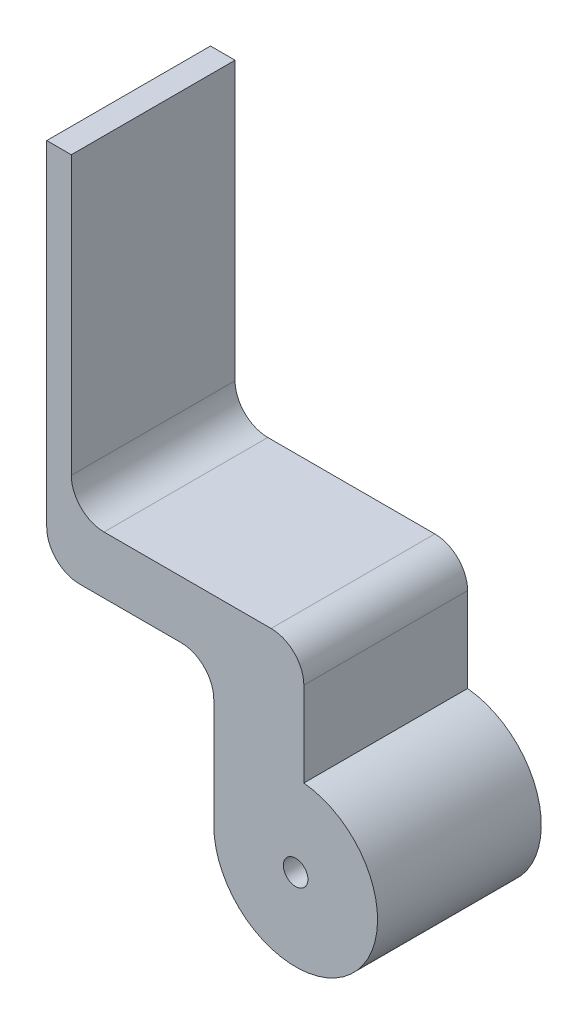
ISO-10303-21;
HEADER;
FILE_DESCRIPTION(('STEP AP214'),'2;1');
FILE_NAME('part.step','',(''),(''),'','','');
FILE_SCHEMA(('AUTOMOTIVE_DESIGN { 1 0 10303 214 1 1 1 1 }'));
ENDSEC;
DATA;
#1=APPLICATION_CONTEXT('core data for automotive mechanical design processes');
#2=APPLICATION_PROTOCOL_DEFINITION('international standard','automotive_design',2000,#1);
#3=PRODUCT_CONTEXT('',#1,'mechanical');
#4=PRODUCT('Part','Part','',(#3));
#5=PRODUCT_RELATED_PRODUCT_CATEGORY('part','',(#4));
#6=PRODUCT_DEFINITION_FORMATION('','',#4);
#7=PRODUCT_DEFINITION_CONTEXT('part definition',#1,'design');
#8=PRODUCT_DEFINITION('design','',#6,#7);
#9=PRODUCT_DEFINITION_SHAPE('','',#8);
#10=(LENGTH_UNIT() NAMED_UNIT(*) SI_UNIT(.MILLI.,.METRE.));
#11=(NAMED_UNIT(*) PLANE_ANGLE_UNIT() SI_UNIT($,.RADIAN.));
#12=(NAMED_UNIT(*) SI_UNIT($,.STERADIAN.) SOLID_ANGLE_UNIT());
#13=UNCERTAINTY_MEASURE_WITH_UNIT(LENGTH_MEASURE(1.E-05),#10,'distance_accuracy_value','');
#14=(GEOMETRIC_REPRESENTATION_CONTEXT(3) GLOBAL_UNCERTAINTY_ASSIGNED_CONTEXT((#13)) GLOBAL_UNIT_ASSIGNED_CONTEXT((#10,
#11,#12)) REPRESENTATION_CONTEXT('',''));
#15=CARTESIAN_POINT('',(0.,0.,0.));
#16=DIRECTION('',(0.,0.,1.));
#17=DIRECTION('',(1.,0.,0.));
#18=AXIS2_PLACEMENT_3D('',#15,#16,#17);
#19=CARTESIAN_POINT('',(-3.,20.3,20.));
#20=DIRECTION('',(0.,0.,-1.));
#21=DIRECTION('',(-1.,0.,0.));
#22=AXIS2_PLACEMENT_3D('',#19,#20,#21);
#23=CYLINDRICAL_SURFACE('',#22,4.);
#24=CARTESIAN_POINT('',(-3.,20.3,0.));
#25=DIRECTION('',(0.,0.,1.));
#26=DIRECTION('',(1.,0.,0.));
#27=AXIS2_PLACEMENT_3D('',#24,#25,#26);
#28=CIRCLE('',#27,4.);
#29=CARTESIAN_POINT('',(0.999999999999997,20.3,0.));
#30=VERTEX_POINT('',#29);
#31=CARTESIAN_POINT('',(-3.,24.3,0.));
#32=VERTEX_POINT('',#31);
#33=EDGE_CURVE('E153',#30,#32,#28,.T.);
#34=ORIENTED_EDGE('',*,*,#33,.T.);
#35=DIRECTION('',(0.,0.,-1.));
#36=VECTOR('',#35,1.);
#37=CARTESIAN_POINT('',(-3.,24.3,20.));
#38=LINE('',#37,#36);
#39=CARTESIAN_POINT('',(-3.,24.3,20.));
#40=VERTEX_POINT('',#39);
#41=EDGE_CURVE('E11',#40,#32,#38,.T.);
#42=ORIENTED_EDGE('',*,*,#41,.F.);
#43=CARTESIAN_POINT('',(-3.,20.3,20.));
#44=DIRECTION('',(0.,0.,1.));
#45=DIRECTION('',(1.,0.,0.));
#46=AXIS2_PLACEMENT_3D('',#43,#44,#45);
#47=CIRCLE('',#46,4.);
#48=CARTESIAN_POINT('',(0.999999999999997,20.3,20.));
#49=VERTEX_POINT('',#48);
#50=EDGE_CURVE('E175',#49,#40,#47,.T.);
#51=ORIENTED_EDGE('',*,*,#50,.F.);
#52=DIRECTION('',(0.,0.,-1.));
#53=VECTOR('',#52,1.);
#54=CARTESIAN_POINT('',(0.999999999999997,20.3,20.));
#55=LINE('',#54,#53);
#56=EDGE_CURVE('E149',#49,#30,#55,.T.);
#57=ORIENTED_EDGE('',*,*,#56,.T.);
#58=EDGE_LOOP('',(#34,#42,#51,#57));
#59=FACE_BOUND('',#58,.T.);
#60=ADVANCED_FACE('F32',(#59),#23,.T.);
#61=CARTESIAN_POINT('',(-23.4,24.3,20.));
#62=DIRECTION('',(0.,-1.,0.));
#63=DIRECTION('',(0.,0.,-1.));
#64=AXIS2_PLACEMENT_3D('',#61,#62,#63);
#65=PLANE('',#64);
#66=DIRECTION('',(-1.,0.,0.));
#67=VECTOR('',#66,1.);
#68=CARTESIAN_POINT('',(-23.4,24.3,0.));
#69=LINE('',#68,#67);
#70=CARTESIAN_POINT('',(-23.4,24.3,0.));
#71=VERTEX_POINT('',#70);
#72=EDGE_CURVE('E156',#32,#71,#69,.T.);
#73=ORIENTED_EDGE('',*,*,#72,.T.);
#74=DIRECTION('',(0.,0.,-1.));
#75=VECTOR('',#74,1.);
#76=CARTESIAN_POINT('',(-23.4,24.3,20.));
#77=LINE('',#76,#75);
#78=CARTESIAN_POINT('',(-23.4,24.3,20.));
#79=VERTEX_POINT('',#78);
#80=EDGE_CURVE('E41',#79,#71,#77,.T.);
#81=ORIENTED_EDGE('',*,*,#80,.F.);
#82=DIRECTION('',(-1.,0.,0.));
#83=VECTOR('',#82,1.);
#84=CARTESIAN_POINT('',(-23.4,24.3,20.));
#85=LINE('',#84,#83);
#86=EDGE_CURVE('E104',#40,#79,#85,.T.);
#87=ORIENTED_EDGE('',*,*,#86,.F.);
#88=ORIENTED_EDGE('',*,*,#41,.T.);
#89=EDGE_LOOP('',(#73,#81,#87,#88));
#90=FACE_BOUND('',#89,.T.);
#91=ADVANCED_FACE('F255',(#90),#65,.F.);
#92=CARTESIAN_POINT('',(-23.4,28.3,20.));
#93=DIRECTION('',(0.,0.,-1.));
#94=DIRECTION('',(-1.,0.,0.));
#95=AXIS2_PLACEMENT_3D('',#92,#93,#94);
#96=CYLINDRICAL_SURFACE('',#95,4.);
#97=CARTESIAN_POINT('',(-23.4,28.3,0.));
#98=DIRECTION('',(0.,0.,-1.));
#99=DIRECTION('',(1.,0.,0.));
#100=AXIS2_PLACEMENT_3D('',#97,#98,#99);
#101=CIRCLE('',#100,4.);
#102=CARTESIAN_POINT('',(-27.4,28.3,0.));
#103=VERTEX_POINT('',#102);
#104=EDGE_CURVE('E158',#71,#103,#101,.T.);
#105=ORIENTED_EDGE('',*,*,#104,.T.);
#106=DIRECTION('',(0.,0.,-1.));
#107=VECTOR('',#106,1.);
#108=CARTESIAN_POINT('',(-27.4,28.3,20.));
#109=LINE('',#108,#107);
#110=CARTESIAN_POINT('',(-27.4,28.3,20.));
#111=VERTEX_POINT('',#110);
#112=EDGE_CURVE('E194',#111,#103,#109,.T.);
#113=ORIENTED_EDGE('',*,*,#112,.F.);
#114=CARTESIAN_POINT('',(-23.4,28.3,20.));
#115=DIRECTION('',(0.,0.,-1.));
#116=DIRECTION('',(1.,0.,0.));
#117=AXIS2_PLACEMENT_3D('',#114,#115,#116);
#118=CIRCLE('',#117,4.);
#119=EDGE_CURVE('E203',#79,#111,#118,.T.);
#120=ORIENTED_EDGE('',*,*,#119,.F.);
#121=ORIENTED_EDGE('',*,*,#80,.T.);
#122=EDGE_LOOP('',(#105,#113,#120,#121));
#123=FACE_BOUND('',#122,.T.);
#124=ADVANCED_FACE('F201',(#123),#96,.F.);
#125=CARTESIAN_POINT('',(-27.4,62.2055220808068,20.));
#126=DIRECTION('',(-1.,0.,0.));
#127=DIRECTION('',(0.,-1.,0.));
#128=AXIS2_PLACEMENT_3D('',#125,#126,#127);
#129=PLANE('',#128);
#130=DIRECTION('',(0.,1.,0.));
#131=VECTOR('',#130,1.);
#132=CARTESIAN_POINT('',(-27.4,62.2055220808068,0.));
#133=LINE('',#132,#131);
#134=CARTESIAN_POINT('',(-27.4,62.2055220808068,0.));
#135=VERTEX_POINT('',#134);
#136=EDGE_CURVE('E160',#103,#135,#133,.T.);
#137=ORIENTED_EDGE('',*,*,#136,.T.);
#138=DIRECTION('',(0.,0.,-1.));
#139=VECTOR('',#138,1.);
#140=CARTESIAN_POINT('',(-27.4,62.2055220808068,20.));
#141=LINE('',#140,#139);
#142=CARTESIAN_POINT('',(-27.4,62.2055220808068,20.));
#143=VERTEX_POINT('',#142);
#144=EDGE_CURVE('E191',#143,#135,#141,.T.);
#145=ORIENTED_EDGE('',*,*,#144,.F.);
#146=DIRECTION('',(0.,1.,0.));
#147=VECTOR('',#146,1.);
#148=CARTESIAN_POINT('',(-27.4,62.2055220808068,20.));
#149=LINE('',#148,#147);
#150=EDGE_CURVE('E221',#111,#143,#149,.T.);
#151=ORIENTED_EDGE('',*,*,#150,.F.);
#152=ORIENTED_EDGE('',*,*,#112,.T.);
#153=EDGE_LOOP('',(#137,#145,#151,#152));
#154=FACE_BOUND('',#153,.T.);
#155=ADVANCED_FACE('F212',(#154),#129,.F.);
#156=CARTESIAN_POINT('',(-30.4,62.2055220808068,20.));
#157=DIRECTION('',(0.,-1.,0.));
#158=DIRECTION('',(0.,0.,-1.));
#159=AXIS2_PLACEMENT_3D('',#156,#157,#158);
#160=PLANE('',#159);
#161=DIRECTION('',(-1.,0.,0.));
#162=VECTOR('',#161,1.);
#163=CARTESIAN_POINT('',(-30.4,62.2055220808068,0.));
#164=LINE('',#163,#162);
#165=CARTESIAN_POINT('',(-30.4,62.2055220808068,0.));
#166=VERTEX_POINT('',#165);
#167=EDGE_CURVE('E162',#135,#166,#164,.T.);
#168=ORIENTED_EDGE('',*,*,#167,.T.);
#169=DIRECTION('',(0.,0.,-1.));
#170=VECTOR('',#169,1.);
#171=CARTESIAN_POINT('',(-30.4,62.2055220808068,20.));
#172=LINE('',#171,#170);
#173=CARTESIAN_POINT('',(-30.4,62.2055220808068,20.));
#174=VERTEX_POINT('',#173);
#175=EDGE_CURVE('E188',#174,#166,#172,.T.);
#176=ORIENTED_EDGE('',*,*,#175,.F.);
#177=DIRECTION('',(-1.,0.,0.));
#178=VECTOR('',#177,1.);
#179=CARTESIAN_POINT('',(-30.4,62.2055220808068,20.));
#180=LINE('',#179,#178);
#181=EDGE_CURVE('E218',#143,#174,#180,.T.);
#182=ORIENTED_EDGE('',*,*,#181,.F.);
#183=ORIENTED_EDGE('',*,*,#144,.T.);
#184=EDGE_LOOP('',(#168,#176,#182,#183));
#185=FACE_BOUND('',#184,.T.);
#186=ADVANCED_FACE('F216',(#185),#160,.F.);
#187=CARTESIAN_POINT('',(-30.4,21.3,20.));
#188=DIRECTION('',(1.,0.,0.));
#189=DIRECTION('',(0.,1.,0.));
#190=AXIS2_PLACEMENT_3D('',#187,#188,#189);
#191=PLANE('',#190);
#192=DIRECTION('',(0.,-1.,0.));
#193=VECTOR('',#192,1.);
#194=CARTESIAN_POINT('',(-30.4,21.3,0.));
#195=LINE('',#194,#193);
#196=CARTESIAN_POINT('',(-30.4,21.3,0.));
#197=VERTEX_POINT('',#196);
#198=EDGE_CURVE('E164',#166,#197,#195,.T.);
#199=ORIENTED_EDGE('',*,*,#198,.T.);
#200=DIRECTION('',(0.,0.,-1.));
#201=VECTOR('',#200,1.);
#202=CARTESIAN_POINT('',(-30.4,21.3,20.));
#203=LINE('',#202,#201);
#204=CARTESIAN_POINT('',(-30.4,21.3,20.));
#205=VERTEX_POINT('',#204);
#206=EDGE_CURVE('E185',#205,#197,#203,.T.);
#207=ORIENTED_EDGE('',*,*,#206,.F.);
#208=DIRECTION('',(0.,-1.,0.));
#209=VECTOR('',#208,1.);
#210=CARTESIAN_POINT('',(-30.4,21.3,20.));
#211=LINE('',#210,#209);
#212=EDGE_CURVE('E220',#174,#205,#211,.T.);
#213=ORIENTED_EDGE('',*,*,#212,.F.);
#214=ORIENTED_EDGE('',*,*,#175,.T.);
#215=EDGE_LOOP('',(#199,#207,#213,#214));
#216=FACE_BOUND('',#215,.T.);
#217=ADVANCED_FACE('F268',(#216),#191,.F.);
#218=CARTESIAN_POINT('',(-26.4,21.3,20.));
#219=DIRECTION('',(0.,0.,-1.));
#220=DIRECTION('',(-1.,0.,0.));
#221=AXIS2_PLACEMENT_3D('',#218,#219,#220);
#222=CYLINDRICAL_SURFACE('',#221,4.);
#223=CARTESIAN_POINT('',(-26.4,21.3,0.));
#224=DIRECTION('',(0.,0.,1.));
#225=DIRECTION('',(1.,0.,0.));
#226=AXIS2_PLACEMENT_3D('',#223,#224,#225);
#227=CIRCLE('',#226,4.);
#228=CARTESIAN_POINT('',(-26.4,17.3,0.));
#229=VERTEX_POINT('',#228);
#230=EDGE_CURVE('E166',#197,#229,#227,.T.);
#231=ORIENTED_EDGE('',*,*,#230,.T.);
#232=DIRECTION('',(0.,0.,-1.));
#233=VECTOR('',#232,1.);
#234=CARTESIAN_POINT('',(-26.4,17.3,20.));
#235=LINE('',#234,#233);
#236=CARTESIAN_POINT('',(-26.4,17.3,20.));
#237=VERTEX_POINT('',#236);
#238=EDGE_CURVE('E182',#237,#229,#235,.T.);
#239=ORIENTED_EDGE('',*,*,#238,.F.);
#240=CARTESIAN_POINT('',(-26.4,21.3,20.));
#241=DIRECTION('',(0.,0.,1.));
#242=DIRECTION('',(1.,0.,0.));
#243=AXIS2_PLACEMENT_3D('',#240,#241,#242);
#244=CIRCLE('',#243,4.);
#245=EDGE_CURVE('E223',#205,#237,#244,.T.);
#246=ORIENTED_EDGE('',*,*,#245,.F.);
#247=ORIENTED_EDGE('',*,*,#206,.T.);
#248=EDGE_LOOP('',(#231,#239,#246,#247));
#249=FACE_BOUND('',#248,.T.);
#250=ADVANCED_FACE('F271',(#249),#222,.T.);
#251=CARTESIAN_POINT('',(-14.,17.3,20.));
#252=DIRECTION('',(0.,1.,0.));
#253=DIRECTION('',(0.,0.,1.));
#254=AXIS2_PLACEMENT_3D('',#251,#252,#253);
#255=PLANE('',#254);
#256=DIRECTION('',(1.,0.,0.));
#257=VECTOR('',#256,1.);
#258=CARTESIAN_POINT('',(-14.,17.3,0.));
#259=LINE('',#258,#257);
#260=CARTESIAN_POINT('',(-14.,17.3,0.));
#261=VERTEX_POINT('',#260);
#262=EDGE_CURVE('E168',#229,#261,#259,.T.);
#263=ORIENTED_EDGE('',*,*,#262,.T.);
#264=DIRECTION('',(0.,0.,-1.));
#265=VECTOR('',#264,1.);
#266=CARTESIAN_POINT('',(-14.,17.3,20.));
#267=LINE('',#266,#265);
#268=CARTESIAN_POINT('',(-14.,17.3,20.));
#269=VERTEX_POINT('',#268);
#270=EDGE_CURVE('E179',#269,#261,#267,.T.);
#271=ORIENTED_EDGE('',*,*,#270,.F.);
#272=DIRECTION('',(1.,0.,0.));
#273=VECTOR('',#272,1.);
#274=CARTESIAN_POINT('',(-14.,17.3,20.));
#275=LINE('',#274,#273);
#276=EDGE_CURVE('E229',#237,#269,#275,.T.);
#277=ORIENTED_EDGE('',*,*,#276,.F.);
#278=ORIENTED_EDGE('',*,*,#238,.T.);
#279=EDGE_LOOP('',(#263,#271,#277,#278));
#280=FACE_BOUND('',#279,.T.);
#281=ADVANCED_FACE('F235',(#280),#255,.F.);
#282=CARTESIAN_POINT('',(-14.,13.3,20.));
#283=DIRECTION('',(0.,0.,-1.));
#284=DIRECTION('',(-1.,0.,0.));
#285=AXIS2_PLACEMENT_3D('',#282,#283,#284);
#286=CYLINDRICAL_SURFACE('',#285,4.);
#287=CARTESIAN_POINT('',(-14.,13.3,0.));
#288=DIRECTION('',(0.,0.,-1.));
#289=DIRECTION('',(1.,0.,0.));
#290=AXIS2_PLACEMENT_3D('',#287,#288,#289);
#291=CIRCLE('',#290,4.);
#292=CARTESIAN_POINT('',(-10.,13.3,0.));
#293=VERTEX_POINT('',#292);
#294=EDGE_CURVE('E170',#261,#293,#291,.T.);
#295=ORIENTED_EDGE('',*,*,#294,.T.);
#296=DIRECTION('',(0.,0.,-1.));
#297=VECTOR('',#296,1.);
#298=CARTESIAN_POINT('',(-10.,13.3,20.));
#299=LINE('',#298,#297);
#300=CARTESIAN_POINT('',(-10.,13.3,20.));
#301=VERTEX_POINT('',#300);
#302=EDGE_CURVE('E144',#301,#293,#299,.T.);
#303=ORIENTED_EDGE('',*,*,#302,.F.);
#304=CARTESIAN_POINT('',(-14.,13.3,20.));
#305=DIRECTION('',(0.,0.,-1.));
#306=DIRECTION('',(1.,0.,0.));
#307=AXIS2_PLACEMENT_3D('',#304,#305,#306);
#308=CIRCLE('',#307,4.);
#309=EDGE_CURVE('E135',#269,#301,#308,.T.);
#310=ORIENTED_EDGE('',*,*,#309,.F.);
#311=ORIENTED_EDGE('',*,*,#270,.T.);
#312=EDGE_LOOP('',(#295,#303,#310,#311));
#313=FACE_BOUND('',#312,.T.);
#314=ADVANCED_FACE('F239',(#313),#286,.F.);
#315=CARTESIAN_POINT('',(-10.,13.3,20.));
#316=DIRECTION('',(1.,0.,0.));
#317=DIRECTION('',(0.,1.,0.));
#318=AXIS2_PLACEMENT_3D('',#315,#316,#317);
#319=PLANE('',#318);
#320=DIRECTION('',(0.,-1.,0.));
#321=VECTOR('',#320,1.);
#322=CARTESIAN_POINT('',(-10.,13.3,0.));
#323=LINE('',#322,#321);
#324=CARTESIAN_POINT('',(-10.,0.,0.));
#325=VERTEX_POINT('',#324);
#326=EDGE_CURVE('E143',#293,#325,#323,.T.);
#327=ORIENTED_EDGE('',*,*,#326,.T.);
#328=DIRECTION('',(0.,0.,-1.));
#329=VECTOR('',#328,1.);
#330=CARTESIAN_POINT('',(-10.,0.,20.));
#331=LINE('',#330,#329);
#332=CARTESIAN_POINT('',(-10.,0.,20.));
#333=VERTEX_POINT('',#332);
#334=EDGE_CURVE('E140',#333,#325,#331,.T.);
#335=ORIENTED_EDGE('',*,*,#334,.F.);
#336=DIRECTION('',(0.,-1.,0.));
#337=VECTOR('',#336,1.);
#338=CARTESIAN_POINT('',(-10.,13.3,20.));
#339=LINE('',#338,#337);
#340=EDGE_CURVE('E129',#301,#333,#339,.T.);
#341=ORIENTED_EDGE('',*,*,#340,.F.);
#342=ORIENTED_EDGE('',*,*,#302,.T.);
#343=EDGE_LOOP('',(#327,#335,#341,#342));
#344=FACE_BOUND('',#343,.T.);
#345=ADVANCED_FACE('F141',(#344),#319,.F.);
#346=CARTESIAN_POINT('',(0.,0.,20.));
#347=DIRECTION('',(0.,0.,-1.));
#348=DIRECTION('',(-1.,0.,0.));
#349=AXIS2_PLACEMENT_3D('',#346,#347,#348);
#350=CYLINDRICAL_SURFACE('',#349,10.);
#351=CARTESIAN_POINT('',(0.,0.,0.));
#352=DIRECTION('',(0.,0.,1.));
#353=DIRECTION('',(1.,0.,0.));
#354=AXIS2_PLACEMENT_3D('',#351,#352,#353);
#355=CIRCLE('',#354,10.);
#356=CARTESIAN_POINT('',(0.999999999999998,9.9498743710662,0.));
#357=VERTEX_POINT('',#356);
#358=EDGE_CURVE('E90',#325,#357,#355,.T.);
#359=ORIENTED_EDGE('',*,*,#358,.T.);
#360=DIRECTION('',(0.,0.,-1.));
#361=VECTOR('',#360,1.);
#362=CARTESIAN_POINT('',(0.999999999999998,9.9498743710662,20.));
#363=LINE('',#362,#361);
#364=CARTESIAN_POINT('',(0.999999999999998,9.9498743710662,20.));
#365=VERTEX_POINT('',#364);
#366=EDGE_CURVE('E145',#365,#357,#363,.T.);
#367=ORIENTED_EDGE('',*,*,#366,.F.);
#368=CARTESIAN_POINT('',(0.,0.,20.));
#369=DIRECTION('',(0.,0.,1.));
#370=DIRECTION('',(1.,0.,0.));
#371=AXIS2_PLACEMENT_3D('',#368,#369,#370);
#372=CIRCLE('',#371,10.);
#373=EDGE_CURVE('E133',#333,#365,#372,.T.);
#374=ORIENTED_EDGE('',*,*,#373,.F.);
#375=ORIENTED_EDGE('',*,*,#334,.T.);
#376=EDGE_LOOP('',(#359,#367,#374,#375));
#377=FACE_BOUND('',#376,.T.);
#378=ADVANCED_FACE('F147',(#377),#350,.T.);
#379=CARTESIAN_POINT('',(0.999999999999997,20.3,20.));
#380=DIRECTION('',(-1.,0.,0.));
#381=DIRECTION('',(0.,-1.,0.));
#382=AXIS2_PLACEMENT_3D('',#379,#380,#381);
#383=PLANE('',#382);
#384=DIRECTION('',(0.,1.,0.));
#385=VECTOR('',#384,1.);
#386=CARTESIAN_POINT('',(0.999999999999997,20.3,0.));
#387=LINE('',#386,#385);
#388=EDGE_CURVE('E96',#357,#30,#387,.T.);
#389=ORIENTED_EDGE('',*,*,#388,.T.);
#390=ORIENTED_EDGE('',*,*,#56,.F.);
#391=DIRECTION('',(0.,1.,0.));
#392=VECTOR('',#391,1.);
#393=CARTESIAN_POINT('',(0.999999999999997,20.3,20.));
#394=LINE('',#393,#392);
#395=EDGE_CURVE('E49',#365,#49,#394,.T.);
#396=ORIENTED_EDGE('',*,*,#395,.F.);
#397=ORIENTED_EDGE('',*,*,#366,.T.);
#398=EDGE_LOOP('',(#389,#390,#396,#397));
#399=FACE_BOUND('',#398,.T.);
#400=ADVANCED_FACE('F243',(#399),#383,.F.);
#401=CARTESIAN_POINT('',(-3.,20.3,20.));
#402=DIRECTION('',(0.,0.,1.));
#403=DIRECTION('',(1.,0.,0.));
#404=AXIS2_PLACEMENT_3D('',#401,#402,#403);
#405=PLANE('',#404);
#406=CARTESIAN_POINT('',(0.,0.,20.));
#407=DIRECTION('',(0.,0.,1.));
#408=DIRECTION('',(1.,0.,0.));
#409=AXIS2_PLACEMENT_3D('',#406,#407,#408);
#410=CIRCLE('',#409,1.5);
#411=CARTESIAN_POINT('',(1.50000000000006,0.,20.));
#412=VERTEX_POINT('',#411);
#413=EDGE_CURVE('E324',#412,#412,#410,.T.);
#414=ORIENTED_EDGE('',*,*,#413,.F.);
#415=EDGE_LOOP('',(#414));
#416=FACE_BOUND('',#415,.T.);
#417=ORIENTED_EDGE('',*,*,#50,.T.);
#418=ORIENTED_EDGE('',*,*,#86,.T.);
#419=ORIENTED_EDGE('',*,*,#119,.T.);
#420=ORIENTED_EDGE('',*,*,#150,.T.);
#421=ORIENTED_EDGE('',*,*,#181,.T.);
#422=ORIENTED_EDGE('',*,*,#212,.T.);
#423=ORIENTED_EDGE('',*,*,#245,.T.);
#424=ORIENTED_EDGE('',*,*,#276,.T.);
#425=ORIENTED_EDGE('',*,*,#309,.T.);
#426=ORIENTED_EDGE('',*,*,#340,.T.);
#427=ORIENTED_EDGE('',*,*,#373,.T.);
#428=ORIENTED_EDGE('',*,*,#395,.T.);
#429=EDGE_LOOP('',(#417,#418,#419,#420,#421,#422,#423,#424,#425,#426,#427,#428));
#430=FACE_BOUND('',#429,.T.);
#431=ADVANCED_FACE('F131',(#416,#430),#405,.T.);
#432=CARTESIAN_POINT('',(-3.,20.3,0.));
#433=DIRECTION('',(0.,0.,1.));
#434=DIRECTION('',(1.,0.,0.));
#435=AXIS2_PLACEMENT_3D('',#432,#433,#434);
#436=PLANE('',#435);
#437=CARTESIAN_POINT('',(0.,0.,0.));
#438=DIRECTION('',(0.,0.,1.));
#439=DIRECTION('',(1.,0.,0.));
#440=AXIS2_PLACEMENT_3D('',#437,#438,#439);
#441=CIRCLE('',#440,1.5);
#442=CARTESIAN_POINT('',(1.50000000000006,0.,0.));
#443=VERTEX_POINT('',#442);
#444=EDGE_CURVE('E35',#443,#443,#441,.T.);
#445=ORIENTED_EDGE('',*,*,#444,.T.);
#446=EDGE_LOOP('',(#445));
#447=FACE_BOUND('',#446,.T.);
#448=ORIENTED_EDGE('',*,*,#33,.F.);
#449=ORIENTED_EDGE('',*,*,#388,.F.);
#450=ORIENTED_EDGE('',*,*,#358,.F.);
#451=ORIENTED_EDGE('',*,*,#326,.F.);
#452=ORIENTED_EDGE('',*,*,#294,.F.);
#453=ORIENTED_EDGE('',*,*,#262,.F.);
#454=ORIENTED_EDGE('',*,*,#230,.F.);
#455=ORIENTED_EDGE('',*,*,#198,.F.);
#456=ORIENTED_EDGE('',*,*,#167,.F.);
#457=ORIENTED_EDGE('',*,*,#136,.F.);
#458=ORIENTED_EDGE('',*,*,#104,.F.);
#459=ORIENTED_EDGE('',*,*,#72,.F.);
#460=EDGE_LOOP('',(#448,#449,#450,#451,#452,#453,#454,#455,#456,#457,#458,#459));
#461=FACE_BOUND('',#460,.T.);
#462=ADVANCED_FACE('F207',(#447,#461),#436,.F.);
#463=CARTESIAN_POINT('',(0.,0.,-10.));
#464=DIRECTION('',(0.,0.,1.));
#465=DIRECTION('',(1.,0.,0.));
#466=AXIS2_PLACEMENT_3D('',#463,#464,#465);
#467=CYLINDRICAL_SURFACE('',#466,1.5);
#468=ORIENTED_EDGE('',*,*,#413,.T.);
#469=EDGE_LOOP('',(#468));
#470=FACE_BOUND('',#469,.T.);
#471=ORIENTED_EDGE('',*,*,#444,.F.);
#472=EDGE_LOOP('',(#471));
#473=FACE_BOUND('',#472,.T.);
#474=ADVANCED_FACE('F308',(#470,#473),#467,.F.);
#475=CLOSED_SHELL('',(#60,#91,#124,#155,#186,#217,#250,#281,#314,#345,#378,#400,#431,#462,#474));
#476=MANIFOLD_SOLID_BREP('B2',#475);
#477=ADVANCED_BREP_SHAPE_REPRESENTATION('',(#18,#476),#14);
#478=SHAPE_DEFINITION_REPRESENTATION(#9,#477);
ENDSEC;
END-ISO-10303-21;
